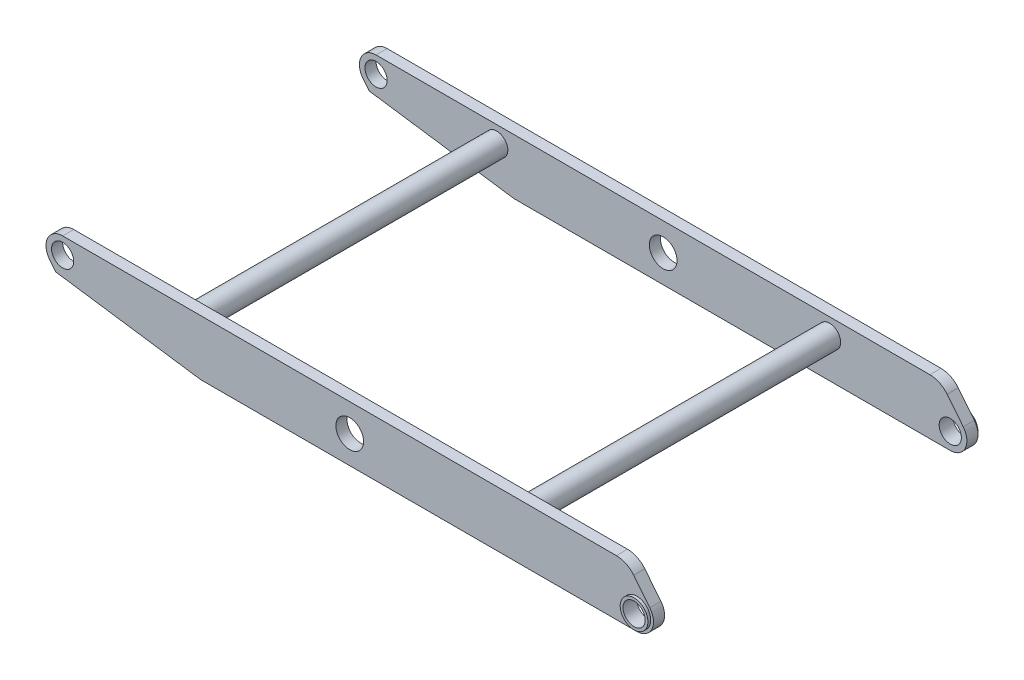
ISO-10303-21;
HEADER;
FILE_DESCRIPTION(('STEP AP214'),'2;1');
FILE_NAME('part.step','',(''),(''),'','','');
FILE_SCHEMA(('AUTOMOTIVE_DESIGN { 1 0 10303 214 1 1 1 1 }'));
ENDSEC;
DATA;
#1=APPLICATION_CONTEXT('core data for automotive mechanical design processes');
#2=APPLICATION_PROTOCOL_DEFINITION('international standard','automotive_design',2000,#1);
#3=PRODUCT_CONTEXT('',#1,'mechanical');
#4=PRODUCT('Part','Part','',(#3));
#5=PRODUCT_RELATED_PRODUCT_CATEGORY('part','',(#4));
#6=PRODUCT_DEFINITION_FORMATION('','',#4);
#7=PRODUCT_DEFINITION_CONTEXT('part definition',#1,'design');
#8=PRODUCT_DEFINITION('design','',#6,#7);
#9=PRODUCT_DEFINITION_SHAPE('','',#8);
#10=(LENGTH_UNIT() NAMED_UNIT(*) SI_UNIT(.MILLI.,.METRE.));
#11=(NAMED_UNIT(*) PLANE_ANGLE_UNIT() SI_UNIT($,.RADIAN.));
#12=(NAMED_UNIT(*) SI_UNIT($,.STERADIAN.) SOLID_ANGLE_UNIT());
#13=UNCERTAINTY_MEASURE_WITH_UNIT(LENGTH_MEASURE(1.E-05),#10,'distance_accuracy_value','');
#14=(GEOMETRIC_REPRESENTATION_CONTEXT(3) GLOBAL_UNCERTAINTY_ASSIGNED_CONTEXT((#13)) GLOBAL_UNIT_ASSIGNED_CONTEXT((#10,
#11,#12)) REPRESENTATION_CONTEXT('',''));
#15=CARTESIAN_POINT('',(0.,0.,0.));
#16=DIRECTION('',(0.,0.,1.));
#17=DIRECTION('',(1.,0.,0.));
#18=AXIS2_PLACEMENT_3D('',#15,#16,#17);
#19=CARTESIAN_POINT('',(48.0775006100537,1.,2.));
#20=DIRECTION('',(0.,0.,-1.));
#21=DIRECTION('',(-1.,0.,0.));
#22=AXIS2_PLACEMENT_3D('',#19,#20,#21);
#23=CYLINDRICAL_SURFACE('',#22,4.);
#24=CARTESIAN_POINT('',(48.0775006100537,1.,0.));
#25=DIRECTION('',(0.,0.,1.));
#26=DIRECTION('',(1.,0.,0.));
#27=AXIS2_PLACEMENT_3D('',#24,#25,#26);
#28=CIRCLE('',#27,4.);
#29=CARTESIAN_POINT('',(51.2009758478259,3.4987801902177,0.));
#30=VERTEX_POINT('',#29);
#31=CARTESIAN_POINT('',(48.0775006100537,5.00000000000001,0.));
#32=VERTEX_POINT('',#31);
#33=EDGE_CURVE('E136',#30,#32,#28,.T.);
#34=ORIENTED_EDGE('',*,*,#33,.T.);
#35=DIRECTION('',(0.,0.,-1.));
#36=VECTOR('',#35,1.);
#37=CARTESIAN_POINT('',(48.0775006100537,5.00000000000001,2.));
#38=LINE('',#37,#36);
#39=CARTESIAN_POINT('',(48.0775006100537,5.00000000000001,2.));
#40=VERTEX_POINT('',#39);
#41=EDGE_CURVE('E168',#40,#32,#38,.T.);
#42=ORIENTED_EDGE('',*,*,#41,.F.);
#43=CARTESIAN_POINT('',(48.0775006100537,1.,2.));
#44=DIRECTION('',(0.,0.,1.));
#45=DIRECTION('',(1.,0.,0.));
#46=AXIS2_PLACEMENT_3D('',#43,#44,#45);
#47=CIRCLE('',#46,4.);
#48=CARTESIAN_POINT('',(51.2009758478259,3.4987801902177,2.));
#49=VERTEX_POINT('',#48);
#50=EDGE_CURVE('E156',#49,#40,#47,.T.);
#51=ORIENTED_EDGE('',*,*,#50,.F.);
#52=DIRECTION('',(0.,0.,-1.));
#53=VECTOR('',#52,1.);
#54=CARTESIAN_POINT('',(51.2009758478259,3.4987801902177,2.));
#55=LINE('',#54,#53);
#56=EDGE_CURVE('E135',#49,#30,#55,.T.);
#57=ORIENTED_EDGE('',*,*,#56,.T.);
#58=EDGE_LOOP('',(#34,#42,#51,#57));
#59=FACE_BOUND('',#58,.T.);
#60=ADVANCED_FACE('F32',(#59),#23,.T.);
#61=CARTESIAN_POINT('',(0.,5.,2.));
#62=DIRECTION('',(0.,-1.,0.));
#63=DIRECTION('',(1.,0.,0.));
#64=AXIS2_PLACEMENT_3D('',#61,#62,#63);
#65=PLANE('',#64);
#66=DIRECTION('',(-1.,0.,0.));
#67=VECTOR('',#66,1.);
#68=CARTESIAN_POINT('',(0.,5.,0.));
#69=LINE('',#68,#67);
#70=CARTESIAN_POINT('',(-51.7581254575403,4.99999999999999,0.));
#71=VERTEX_POINT('',#70);
#72=EDGE_CURVE('E139',#32,#71,#69,.T.);
#73=ORIENTED_EDGE('',*,*,#72,.T.);
#74=DIRECTION('',(0.,0.,-1.));
#75=VECTOR('',#74,1.);
#76=CARTESIAN_POINT('',(-51.7581254575403,4.99999999999999,2.));
#77=LINE('',#76,#75);
#78=CARTESIAN_POINT('',(-51.7581254575403,4.99999999999999,2.));
#79=VERTEX_POINT('',#78);
#80=EDGE_CURVE('E165',#79,#71,#77,.T.);
#81=ORIENTED_EDGE('',*,*,#80,.F.);
#82=DIRECTION('',(-1.,0.,0.));
#83=VECTOR('',#82,1.);
#84=CARTESIAN_POINT('',(0.,5.,2.));
#85=LINE('',#84,#83);
#86=EDGE_CURVE('E93',#40,#79,#85,.T.);
#87=ORIENTED_EDGE('',*,*,#86,.F.);
#88=ORIENTED_EDGE('',*,*,#41,.T.);
#89=EDGE_LOOP('',(#73,#81,#87,#88));
#90=FACE_BOUND('',#89,.T.);
#91=ADVANCED_FACE('F206',(#90),#65,.F.);
#92=CARTESIAN_POINT('',(-51.7581254575403,1.99999999999999,2.));
#93=DIRECTION('',(0.,0.,-1.));
#94=DIRECTION('',(-1.,0.,0.));
#95=AXIS2_PLACEMENT_3D('',#92,#93,#94);
#96=CYLINDRICAL_SURFACE('',#95,3.);
#97=CARTESIAN_POINT('',(-51.7581254575403,1.99999999999999,0.));
#98=DIRECTION('',(0.,0.,1.));
#99=DIRECTION('',(1.,0.,0.));
#100=AXIS2_PLACEMENT_3D('',#97,#98,#99);
#101=CIRCLE('',#100,3.);
#102=CARTESIAN_POINT('',(-54.1007318858694,0.125914857336724,0.));
#103=VERTEX_POINT('',#102);
#104=EDGE_CURVE('E142',#71,#103,#101,.T.);
#105=ORIENTED_EDGE('',*,*,#104,.T.);
#106=DIRECTION('',(0.,0.,-1.));
#107=VECTOR('',#106,1.);
#108=CARTESIAN_POINT('',(-54.1007318858694,0.125914857336724,2.));
#109=LINE('',#108,#107);
#110=CARTESIAN_POINT('',(-54.1007318858694,0.125914857336724,2.));
#111=VERTEX_POINT('',#110);
#112=EDGE_CURVE('E162',#111,#103,#109,.T.);
#113=ORIENTED_EDGE('',*,*,#112,.F.);
#114=CARTESIAN_POINT('',(-51.7581254575403,1.99999999999999,2.));
#115=DIRECTION('',(0.,0.,1.));
#116=DIRECTION('',(1.,0.,0.));
#117=AXIS2_PLACEMENT_3D('',#114,#115,#116);
#118=CIRCLE('',#117,3.);
#119=EDGE_CURVE('E226',#79,#111,#118,.T.);
#120=ORIENTED_EDGE('',*,*,#119,.F.);
#121=ORIENTED_EDGE('',*,*,#80,.T.);
#122=EDGE_LOOP('',(#105,#113,#120,#121));
#123=FACE_BOUND('',#122,.T.);
#124=ADVANCED_FACE('F211',(#123),#96,.T.);
#125=CARTESIAN_POINT('',(-32.9268292682927,-26.3414634146342,2.));
#126=DIRECTION('',(0.780868809443031,0.624695047554424,0.));
#127=DIRECTION('',(-0.624695047554424,0.780868809443031,0.));
#128=AXIS2_PLACEMENT_3D('',#125,#126,#127);
#129=PLANE('',#128);
#130=DIRECTION('',(0.624695047554424,-0.780868809443031,0.));
#131=VECTOR('',#130,1.);
#132=CARTESIAN_POINT('',(-32.9268292682927,-26.3414634146342,0.));
#133=LINE('',#132,#131);
#134=CARTESIAN_POINT('',(-53.0025750009278,-1.24678124884027,0.));
#135=VERTEX_POINT('',#134);
#136=EDGE_CURVE('E144',#103,#135,#133,.T.);
#137=ORIENTED_EDGE('',*,*,#136,.T.);
#138=DIRECTION('',(0.,0.,-1.));
#139=VECTOR('',#138,1.);
#140=CARTESIAN_POINT('',(-53.0025750009278,-1.24678124884027,2.));
#141=LINE('',#140,#139);
#142=CARTESIAN_POINT('',(-53.0025750009278,-1.24678124884027,2.));
#143=VERTEX_POINT('',#142);
#144=EDGE_CURVE('E160',#143,#135,#141,.T.);
#145=ORIENTED_EDGE('',*,*,#144,.F.);
#146=DIRECTION('',(0.624695047554424,-0.780868809443031,0.));
#147=VECTOR('',#146,1.);
#148=CARTESIAN_POINT('',(-32.9268292682927,-26.3414634146342,2.));
#149=LINE('',#148,#147);
#150=EDGE_CURVE('E227',#111,#143,#149,.T.);
#151=ORIENTED_EDGE('',*,*,#150,.F.);
#152=ORIENTED_EDGE('',*,*,#112,.T.);
#153=EDGE_LOOP('',(#137,#145,#151,#152));
#154=FACE_BOUND('',#153,.T.);
#155=ADVANCED_FACE('F221',(#154),#129,.F.);
#156=CARTESIAN_POINT('',(-1.24846132995408,-8.68574917852038,2.));
#157=DIRECTION('',(-0.142274546472411,-0.989827234130315,0.));
#158=DIRECTION('',(0.989827234130315,-0.142274546472411,0.));
#159=AXIS2_PLACEMENT_3D('',#156,#157,#158);
#160=PLANE('',#159);
#161=DIRECTION('',(-0.989827234130315,0.142274546472411,0.));
#162=VECTOR('',#161,1.);
#163=CARTESIAN_POINT('',(-1.24846132995408,-8.68574917852038,0.));
#164=LINE('',#163,#162);
#165=CARTESIAN_POINT('',(-26.8908197526559,-5.00000000000001,0.));
#166=VERTEX_POINT('',#165);
#167=EDGE_CURVE('E147',#166,#135,#164,.T.);
#168=ORIENTED_EDGE('',*,*,#167,.F.);
#169=DIRECTION('',(0.,0.,-1.));
#170=VECTOR('',#169,1.);
#171=CARTESIAN_POINT('',(-26.8908197526559,-5.00000000000001,2.));
#172=LINE('',#171,#170);
#173=CARTESIAN_POINT('',(-26.8908197526559,-5.00000000000001,2.));
#174=VERTEX_POINT('',#173);
#175=EDGE_CURVE('E124',#174,#166,#172,.T.);
#176=ORIENTED_EDGE('',*,*,#175,.F.);
#177=DIRECTION('',(-0.989827234130315,0.142274546472411,0.));
#178=VECTOR('',#177,1.);
#179=CARTESIAN_POINT('',(-1.24846132995408,-8.68574917852038,2.));
#180=LINE('',#179,#178);
#181=EDGE_CURVE('E117',#174,#143,#180,.T.);
#182=ORIENTED_EDGE('',*,*,#181,.T.);
#183=ORIENTED_EDGE('',*,*,#144,.T.);
#184=EDGE_LOOP('',(#168,#176,#182,#183));
#185=FACE_BOUND('',#184,.T.);
#186=ADVANCED_FACE('F217',(#185),#160,.T.);
#187=CARTESIAN_POINT('',(0.,-5.00000000000001,2.));
#188=DIRECTION('',(0.,1.,0.));
#189=DIRECTION('',(-1.,0.,0.));
#190=AXIS2_PLACEMENT_3D('',#187,#188,#189);
#191=PLANE('',#190);
#192=DIRECTION('',(1.,0.,0.));
#193=VECTOR('',#192,1.);
#194=CARTESIAN_POINT('',(0.,-5.00000000000001,0.));
#195=LINE('',#194,#193);
#196=CARTESIAN_POINT('',(51.7581254575403,-5.00000000000001,0.));
#197=VERTEX_POINT('',#196);
#198=EDGE_CURVE('E123',#166,#197,#195,.T.);
#199=ORIENTED_EDGE('',*,*,#198,.T.);
#200=DIRECTION('',(0.,0.,-1.));
#201=VECTOR('',#200,1.);
#202=CARTESIAN_POINT('',(51.7581254575403,-5.00000000000001,2.));
#203=LINE('',#202,#201);
#204=CARTESIAN_POINT('',(51.7581254575403,-5.00000000000001,2.));
#205=VERTEX_POINT('',#204);
#206=EDGE_CURVE('E120',#205,#197,#203,.T.);
#207=ORIENTED_EDGE('',*,*,#206,.F.);
#208=DIRECTION('',(1.,0.,0.));
#209=VECTOR('',#208,1.);
#210=CARTESIAN_POINT('',(0.,-5.00000000000001,2.));
#211=LINE('',#210,#209);
#212=EDGE_CURVE('E110',#174,#205,#211,.T.);
#213=ORIENTED_EDGE('',*,*,#212,.F.);
#214=ORIENTED_EDGE('',*,*,#175,.T.);
#215=EDGE_LOOP('',(#199,#207,#213,#214));
#216=FACE_BOUND('',#215,.T.);
#217=ADVANCED_FACE('F121',(#216),#191,.F.);
#218=CARTESIAN_POINT('',(51.7581254575403,-2.00000000000001,2.));
#219=DIRECTION('',(0.,0.,-1.));
#220=DIRECTION('',(-1.,0.,0.));
#221=AXIS2_PLACEMENT_3D('',#218,#219,#220);
#222=CYLINDRICAL_SURFACE('',#221,3.00000000000001);
#223=CARTESIAN_POINT('',(51.7581254575403,-2.00000000000001,0.));
#224=DIRECTION('',(0.,0.,1.));
#225=DIRECTION('',(1.,0.,0.));
#226=AXIS2_PLACEMENT_3D('',#223,#224,#225);
#227=CIRCLE('',#226,3.00000000000001);
#228=CARTESIAN_POINT('',(54.1007318858694,-0.125914857336731,0.));
#229=VERTEX_POINT('',#228);
#230=EDGE_CURVE('E78',#197,#229,#227,.T.);
#231=ORIENTED_EDGE('',*,*,#230,.T.);
#232=DIRECTION('',(0.,0.,-1.));
#233=VECTOR('',#232,1.);
#234=CARTESIAN_POINT('',(54.1007318858694,-0.125914857336731,2.));
#235=LINE('',#234,#233);
#236=CARTESIAN_POINT('',(54.1007318858694,-0.125914857336731,2.));
#237=VERTEX_POINT('',#236);
#238=EDGE_CURVE('E125',#237,#229,#235,.T.);
#239=ORIENTED_EDGE('',*,*,#238,.F.);
#240=CARTESIAN_POINT('',(51.7581254575403,-2.00000000000001,2.));
#241=DIRECTION('',(0.,0.,1.));
#242=DIRECTION('',(1.,0.,0.));
#243=AXIS2_PLACEMENT_3D('',#240,#241,#242);
#244=CIRCLE('',#243,3.00000000000001);
#245=EDGE_CURVE('E115',#205,#237,#244,.T.);
#246=ORIENTED_EDGE('',*,*,#245,.F.);
#247=ORIENTED_EDGE('',*,*,#206,.T.);
#248=EDGE_LOOP('',(#231,#239,#246,#247));
#249=FACE_BOUND('',#248,.T.);
#250=ADVANCED_FACE('F127',(#249),#222,.T.);
#251=CARTESIAN_POINT('',(32.9268292682927,26.3414634146341,2.));
#252=DIRECTION('',(-0.780868809443031,-0.624695047554424,0.));
#253=DIRECTION('',(0.624695047554424,-0.780868809443031,0.));
#254=AXIS2_PLACEMENT_3D('',#251,#252,#253);
#255=PLANE('',#254);
#256=DIRECTION('',(-0.624695047554424,0.780868809443031,0.));
#257=VECTOR('',#256,1.);
#258=CARTESIAN_POINT('',(32.9268292682927,26.3414634146341,0.));
#259=LINE('',#258,#257);
#260=EDGE_CURVE('E84',#229,#30,#259,.T.);
#261=ORIENTED_EDGE('',*,*,#260,.T.);
#262=ORIENTED_EDGE('',*,*,#56,.F.);
#263=DIRECTION('',(-0.624695047554424,0.780868809443031,0.));
#264=VECTOR('',#263,1.);
#265=CARTESIAN_POINT('',(32.9268292682927,26.3414634146341,2.));
#266=LINE('',#265,#264);
#267=EDGE_CURVE('E48',#237,#49,#266,.T.);
#268=ORIENTED_EDGE('',*,*,#267,.F.);
#269=ORIENTED_EDGE('',*,*,#238,.T.);
#270=EDGE_LOOP('',(#261,#262,#268,#269));
#271=FACE_BOUND('',#270,.T.);
#272=ADVANCED_FACE('F195',(#271),#255,.F.);
#273=CARTESIAN_POINT('',(0.,0.,2.));
#274=DIRECTION('',(0.,0.,-1.));
#275=DIRECTION('',(-1.,0.,0.));
#276=AXIS2_PLACEMENT_3D('',#273,#274,#275);
#277=CYLINDRICAL_SURFACE('',#276,2.5);
#278=CARTESIAN_POINT('',(0.,0.,2.));
#279=DIRECTION('',(0.,0.,1.));
#280=DIRECTION('',(1.,0.,0.));
#281=AXIS2_PLACEMENT_3D('',#278,#279,#280);
#282=CIRCLE('',#281,2.5);
#283=CARTESIAN_POINT('',(2.5,0.,2.));
#284=VERTEX_POINT('',#283);
#285=EDGE_CURVE('E129',#284,#284,#282,.T.);
#286=ORIENTED_EDGE('',*,*,#285,.T.);
#287=EDGE_LOOP('',(#286));
#288=FACE_BOUND('',#287,.T.);
#289=CARTESIAN_POINT('',(0.,0.,0.));
#290=DIRECTION('',(0.,0.,1.));
#291=DIRECTION('',(1.,0.,0.));
#292=AXIS2_PLACEMENT_3D('',#289,#290,#291);
#293=CIRCLE('',#292,2.5);
#294=CARTESIAN_POINT('',(2.5,0.,0.));
#295=VERTEX_POINT('',#294);
#296=EDGE_CURVE('E153',#295,#295,#293,.T.);
#297=ORIENTED_EDGE('',*,*,#296,.F.);
#298=EDGE_LOOP('',(#297));
#299=FACE_BOUND('',#298,.T.);
#300=ADVANCED_FACE('F193',(#288,#299),#277,.F.);
#301=CARTESIAN_POINT('',(0.,0.,2.));
#302=DIRECTION('',(0.,0.,1.));
#303=DIRECTION('',(1.,0.,0.));
#304=AXIS2_PLACEMENT_3D('',#301,#302,#303);
#305=PLANE('',#304);
#306=CARTESIAN_POINT('',(-51.7581254575403,1.99999999999999,2.));
#307=DIRECTION('',(0.,0.,1.));
#308=DIRECTION('',(1.,0.,0.));
#309=AXIS2_PLACEMENT_3D('',#306,#307,#308);
#310=CIRCLE('',#309,2.);
#311=CARTESIAN_POINT('',(-49.7581254575403,1.99999999999999,2.));
#312=VERTEX_POINT('',#311);
#313=EDGE_CURVE('E236',#312,#312,#310,.T.);
#314=ORIENTED_EDGE('',*,*,#313,.F.);
#315=EDGE_LOOP('',(#314));
#316=FACE_BOUND('',#315,.T.);
#317=CARTESIAN_POINT('',(51.7581254575403,-2.00000000000001,2.));
#318=DIRECTION('',(0.,0.,1.));
#319=DIRECTION('',(1.,0.,0.));
#320=AXIS2_PLACEMENT_3D('',#317,#318,#319);
#321=CIRCLE('',#320,2.5);
#322=CARTESIAN_POINT('',(54.2581254575403,-2.00000000000001,2.));
#323=VERTEX_POINT('',#322);
#324=EDGE_CURVE('E233',#323,#323,#321,.T.);
#325=ORIENTED_EDGE('',*,*,#324,.F.);
#326=EDGE_LOOP('',(#325));
#327=FACE_BOUND('',#326,.T.);
#328=ORIENTED_EDGE('',*,*,#50,.T.);
#329=ORIENTED_EDGE('',*,*,#86,.T.);
#330=ORIENTED_EDGE('',*,*,#119,.T.);
#331=ORIENTED_EDGE('',*,*,#150,.T.);
#332=ORIENTED_EDGE('',*,*,#181,.F.);
#333=ORIENTED_EDGE('',*,*,#212,.T.);
#334=ORIENTED_EDGE('',*,*,#245,.T.);
#335=ORIENTED_EDGE('',*,*,#267,.T.);
#336=EDGE_LOOP('',(#328,#329,#330,#331,#332,#333,#334,#335));
#337=FACE_BOUND('',#336,.T.);
#338=ORIENTED_EDGE('',*,*,#285,.F.);
#339=EDGE_LOOP('',(#338));
#340=FACE_BOUND('',#339,.T.);
#341=ADVANCED_FACE('F112',(#316,#327,#337,#340),#305,.T.);
#342=CARTESIAN_POINT('',(0.,0.,0.));
#343=DIRECTION('',(0.,0.,1.));
#344=DIRECTION('',(1.,0.,0.));
#345=AXIS2_PLACEMENT_3D('',#342,#343,#344);
#346=PLANE('',#345);
#347=CARTESIAN_POINT('',(30.,2.,0.));
#348=DIRECTION('',(0.,0.,1.));
#349=DIRECTION('',(1.,0.,0.));
#350=AXIS2_PLACEMENT_3D('',#347,#348,#349);
#351=CIRCLE('',#350,2.);
#352=CARTESIAN_POINT('',(32.,2.,0.));
#353=VERTEX_POINT('',#352);
#354=EDGE_CURVE('E11',#353,#353,#351,.F.);
#355=ORIENTED_EDGE('',*,*,#354,.F.);
#356=EDGE_LOOP('',(#355));
#357=FACE_BOUND('',#356,.T.);
#358=CARTESIAN_POINT('',(-30.,2.,0.));
#359=DIRECTION('',(0.,0.,1.));
#360=DIRECTION('',(1.,0.,0.));
#361=AXIS2_PLACEMENT_3D('',#358,#359,#360);
#362=CIRCLE('',#361,2.);
#363=CARTESIAN_POINT('',(-28.,2.,0.));
#364=VERTEX_POINT('',#363);
#365=EDGE_CURVE('E40',#364,#364,#362,.F.);
#366=ORIENTED_EDGE('',*,*,#365,.F.);
#367=EDGE_LOOP('',(#366));
#368=FACE_BOUND('',#367,.T.);
#369=CARTESIAN_POINT('',(-51.7581254575403,1.99999999999999,0.));
#370=DIRECTION('',(0.,0.,1.));
#371=DIRECTION('',(1.,0.,0.));
#372=AXIS2_PLACEMENT_3D('',#369,#370,#371);
#373=CIRCLE('',#372,2.);
#374=CARTESIAN_POINT('',(-49.7581254575403,1.99999999999999,0.));
#375=VERTEX_POINT('',#374);
#376=EDGE_CURVE('E184',#375,#375,#373,.T.);
#377=ORIENTED_EDGE('',*,*,#376,.T.);
#378=EDGE_LOOP('',(#377));
#379=FACE_BOUND('',#378,.T.);
#380=CARTESIAN_POINT('',(51.7581254575403,-2.00000000000001,0.));
#381=DIRECTION('',(0.,0.,1.));
#382=DIRECTION('',(1.,0.,0.));
#383=AXIS2_PLACEMENT_3D('',#380,#381,#382);
#384=CIRCLE('',#383,2.);
#385=CARTESIAN_POINT('',(53.7581254575403,-2.00000000000001,0.));
#386=VERTEX_POINT('',#385);
#387=EDGE_CURVE('E188',#386,#386,#384,.T.);
#388=ORIENTED_EDGE('',*,*,#387,.T.);
#389=EDGE_LOOP('',(#388));
#390=FACE_BOUND('',#389,.T.);
#391=ORIENTED_EDGE('',*,*,#33,.F.);
#392=ORIENTED_EDGE('',*,*,#260,.F.);
#393=ORIENTED_EDGE('',*,*,#230,.F.);
#394=ORIENTED_EDGE('',*,*,#198,.F.);
#395=ORIENTED_EDGE('',*,*,#167,.T.);
#396=ORIENTED_EDGE('',*,*,#136,.F.);
#397=ORIENTED_EDGE('',*,*,#104,.F.);
#398=ORIENTED_EDGE('',*,*,#72,.F.);
#399=EDGE_LOOP('',(#391,#392,#393,#394,#395,#396,#397,#398));
#400=FACE_BOUND('',#399,.T.);
#401=ORIENTED_EDGE('',*,*,#296,.T.);
#402=EDGE_LOOP('',(#401));
#403=FACE_BOUND('',#402,.T.);
#404=ADVANCED_FACE('F175',(#357,#368,#379,#390,#400,#403),#346,.F.);
#405=CARTESIAN_POINT('',(51.7581254575403,-2.00000000000001,2.5));
#406=DIRECTION('',(0.,0.,-1.));
#407=DIRECTION('',(-1.,0.,0.));
#408=AXIS2_PLACEMENT_3D('',#405,#406,#407);
#409=CYLINDRICAL_SURFACE('',#408,2.5);
#410=CARTESIAN_POINT('',(51.7581254575403,-2.00000000000001,2.5));
#411=DIRECTION('',(0.,0.,1.));
#412=DIRECTION('',(1.,0.,0.));
#413=AXIS2_PLACEMENT_3D('',#410,#411,#412);
#414=CIRCLE('',#413,2.5);
#415=CARTESIAN_POINT('',(54.2581254575403,-2.00000000000001,2.5));
#416=VERTEX_POINT('',#415);
#417=EDGE_CURVE('E140',#416,#416,#414,.T.);
#418=ORIENTED_EDGE('',*,*,#417,.F.);
#419=EDGE_LOOP('',(#418));
#420=FACE_BOUND('',#419,.T.);
#421=ORIENTED_EDGE('',*,*,#324,.T.);
#422=EDGE_LOOP('',(#421));
#423=FACE_BOUND('',#422,.T.);
#424=ADVANCED_FACE('F178',(#420,#423),#409,.T.);
#425=CARTESIAN_POINT('',(51.7581254575403,-2.00000000000001,2.5));
#426=DIRECTION('',(0.,0.,1.));
#427=DIRECTION('',(1.,0.,0.));
#428=AXIS2_PLACEMENT_3D('',#425,#426,#427);
#429=PLANE('',#428);
#430=CARTESIAN_POINT('',(51.7581254575403,-2.00000000000001,2.5));
#431=DIRECTION('',(0.,0.,1.));
#432=DIRECTION('',(1.,0.,0.));
#433=AXIS2_PLACEMENT_3D('',#430,#431,#432);
#434=CIRCLE('',#433,2.);
#435=CARTESIAN_POINT('',(53.7581254575403,-2.00000000000001,2.5));
#436=VERTEX_POINT('',#435);
#437=EDGE_CURVE('E242',#436,#436,#434,.T.);
#438=ORIENTED_EDGE('',*,*,#437,.F.);
#439=EDGE_LOOP('',(#438));
#440=FACE_BOUND('',#439,.T.);
#441=ORIENTED_EDGE('',*,*,#417,.T.);
#442=EDGE_LOOP('',(#441));
#443=FACE_BOUND('',#442,.T.);
#444=ADVANCED_FACE('F421',(#440,#443),#429,.T.);
#445=CARTESIAN_POINT('',(51.7581254575403,-2.00000000000001,0.));
#446=DIRECTION('',(0.,0.,1.));
#447=DIRECTION('',(1.,0.,0.));
#448=AXIS2_PLACEMENT_3D('',#445,#446,#447);
#449=CYLINDRICAL_SURFACE('',#448,2.);
#450=ORIENTED_EDGE('',*,*,#387,.F.);
#451=EDGE_LOOP('',(#450));
#452=FACE_BOUND('',#451,.T.);
#453=ORIENTED_EDGE('',*,*,#437,.T.);
#454=EDGE_LOOP('',(#453));
#455=FACE_BOUND('',#454,.T.);
#456=ADVANCED_FACE('F417',(#452,#455),#449,.F.);
#457=CARTESIAN_POINT('',(-51.7581254575403,1.99999999999999,0.));
#458=DIRECTION('',(0.,0.,1.));
#459=DIRECTION('',(1.,0.,0.));
#460=AXIS2_PLACEMENT_3D('',#457,#458,#459);
#461=CYLINDRICAL_SURFACE('',#460,2.);
#462=ORIENTED_EDGE('',*,*,#313,.T.);
#463=EDGE_LOOP('',(#462));
#464=FACE_BOUND('',#463,.T.);
#465=ORIENTED_EDGE('',*,*,#376,.F.);
#466=EDGE_LOOP('',(#465));
#467=FACE_BOUND('',#466,.T.);
#468=ADVANCED_FACE('F414',(#464,#467),#461,.F.);
#469=CARTESIAN_POINT('',(-30.,2.,-27.25));
#470=DIRECTION('',(0.,0.,1.));
#471=DIRECTION('',(1.,0.,0.));
#472=AXIS2_PLACEMENT_3D('',#469,#470,#471);
#473=CYLINDRICAL_SURFACE('',#472,2.);
#474=ORIENTED_EDGE('',*,*,#365,.T.);
#475=EDGE_LOOP('',(#474));
#476=FACE_BOUND('',#475,.T.);
#477=CARTESIAN_POINT('',(-30.,2.,-54.5));
#478=DIRECTION('',(0.,0.,1.));
#479=DIRECTION('',(1.,0.,0.));
#480=AXIS2_PLACEMENT_3D('',#477,#478,#479);
#481=CIRCLE('',#480,2.);
#482=CARTESIAN_POINT('',(-28.,2.,-54.5));
#483=VERTEX_POINT('',#482);
#484=EDGE_CURVE('E249',#483,#483,#481,.F.);
#485=ORIENTED_EDGE('',*,*,#484,.F.);
#486=EDGE_LOOP('',(#485));
#487=FACE_BOUND('',#486,.T.);
#488=ADVANCED_FACE('F172',(#476,#487),#473,.T.);
#489=CARTESIAN_POINT('',(30.,2.,-27.25));
#490=DIRECTION('',(0.,0.,1.));
#491=DIRECTION('',(1.,0.,0.));
#492=AXIS2_PLACEMENT_3D('',#489,#490,#491);
#493=CYLINDRICAL_SURFACE('',#492,2.);
#494=ORIENTED_EDGE('',*,*,#354,.T.);
#495=EDGE_LOOP('',(#494));
#496=FACE_BOUND('',#495,.T.);
#497=CARTESIAN_POINT('',(30.,2.,-54.5));
#498=DIRECTION('',(0.,0.,1.));
#499=DIRECTION('',(1.,0.,0.));
#500=AXIS2_PLACEMENT_3D('',#497,#498,#499);
#501=CIRCLE('',#500,2.);
#502=CARTESIAN_POINT('',(32.,2.,-54.5));
#503=VERTEX_POINT('',#502);
#504=EDGE_CURVE('E245',#503,#503,#501,.F.);
#505=ORIENTED_EDGE('',*,*,#504,.F.);
#506=EDGE_LOOP('',(#505));
#507=FACE_BOUND('',#506,.T.);
#508=ADVANCED_FACE('F407',(#496,#507),#493,.T.);
#509=CARTESIAN_POINT('',(48.0775006100537,1.,-56.5));
#510=DIRECTION('',(0.,0.,1.));
#511=DIRECTION('',(-1.,0.,0.));
#512=AXIS2_PLACEMENT_3D('',#509,#510,#511);
#513=CYLINDRICAL_SURFACE('',#512,4.);
#514=CARTESIAN_POINT('',(48.0775006100537,1.,-54.5));
#515=DIRECTION('',(0.,0.,1.));
#516=DIRECTION('',(1.,0.,0.));
#517=AXIS2_PLACEMENT_3D('',#514,#515,#516);
#518=CIRCLE('',#517,4.);
#519=CARTESIAN_POINT('',(51.2009758478259,3.4987801902177,-54.5));
#520=VERTEX_POINT('',#519);
#521=CARTESIAN_POINT('',(48.0775006100537,5.00000000000001,-54.5));
#522=VERTEX_POINT('',#521);
#523=EDGE_CURVE('E302',#520,#522,#518,.T.);
#524=ORIENTED_EDGE('',*,*,#523,.F.);
#525=DIRECTION('',(0.,0.,1.));
#526=VECTOR('',#525,1.);
#527=CARTESIAN_POINT('',(51.2009758478259,3.4987801902177,-56.5));
#528=LINE('',#527,#526);
#529=CARTESIAN_POINT('',(51.2009758478259,3.4987801902177,-56.5));
#530=VERTEX_POINT('',#529);
#531=EDGE_CURVE('E273',#530,#520,#528,.T.);
#532=ORIENTED_EDGE('',*,*,#531,.F.);
#533=CARTESIAN_POINT('',(48.0775006100537,1.,-56.5));
#534=DIRECTION('',(0.,0.,1.));
#535=DIRECTION('',(1.,0.,0.));
#536=AXIS2_PLACEMENT_3D('',#533,#534,#535);
#537=CIRCLE('',#536,4.);
#538=CARTESIAN_POINT('',(48.0775006100537,5.00000000000001,-56.5));
#539=VERTEX_POINT('',#538);
#540=EDGE_CURVE('E280',#530,#539,#537,.T.);
#541=ORIENTED_EDGE('',*,*,#540,.T.);
#542=DIRECTION('',(0.,0.,1.));
#543=VECTOR('',#542,1.);
#544=CARTESIAN_POINT('',(48.0775006100537,5.00000000000001,-56.5));
#545=LINE('',#544,#543);
#546=EDGE_CURVE('E252',#539,#522,#545,.T.);
#547=ORIENTED_EDGE('',*,*,#546,.T.);
#548=EDGE_LOOP('',(#524,#532,#541,#547));
#549=FACE_BOUND('',#548,.T.);
#550=ADVANCED_FACE('F403',(#549),#513,.T.);
#551=CARTESIAN_POINT('',(0.,5.,-56.5));
#552=DIRECTION('',(0.,-1.,0.));
#553=DIRECTION('',(1.,0.,0.));
#554=AXIS2_PLACEMENT_3D('',#551,#552,#553);
#555=PLANE('',#554);
#556=DIRECTION('',(-1.,0.,0.));
#557=VECTOR('',#556,1.);
#558=CARTESIAN_POINT('',(0.,5.,-54.5));
#559=LINE('',#558,#557);
#560=CARTESIAN_POINT('',(-51.7581254575403,4.99999999999999,-54.5));
#561=VERTEX_POINT('',#560);
#562=EDGE_CURVE('E299',#522,#561,#559,.T.);
#563=ORIENTED_EDGE('',*,*,#562,.F.);
#564=ORIENTED_EDGE('',*,*,#546,.F.);
#565=DIRECTION('',(-1.,0.,0.));
#566=VECTOR('',#565,1.);
#567=CARTESIAN_POINT('',(0.,5.,-56.5));
#568=LINE('',#567,#566);
#569=CARTESIAN_POINT('',(-51.7581254575403,4.99999999999999,-56.5));
#570=VERTEX_POINT('',#569);
#571=EDGE_CURVE('E326',#539,#570,#568,.T.);
#572=ORIENTED_EDGE('',*,*,#571,.T.);
#573=DIRECTION('',(0.,0.,1.));
#574=VECTOR('',#573,1.);
#575=CARTESIAN_POINT('',(-51.7581254575403,4.99999999999999,-56.5));
#576=LINE('',#575,#574);
#577=EDGE_CURVE('E255',#570,#561,#576,.T.);
#578=ORIENTED_EDGE('',*,*,#577,.T.);
#579=EDGE_LOOP('',(#563,#564,#572,#578));
#580=FACE_BOUND('',#579,.T.);
#581=ADVANCED_FACE('F399',(#580),#555,.F.);
#582=CARTESIAN_POINT('',(-51.7581254575403,1.99999999999999,-56.5));
#583=DIRECTION('',(0.,0.,1.));
#584=DIRECTION('',(-1.,0.,0.));
#585=AXIS2_PLACEMENT_3D('',#582,#583,#584);
#586=CYLINDRICAL_SURFACE('',#585,3.);
#587=CARTESIAN_POINT('',(-51.7581254575403,1.99999999999999,-54.5));
#588=DIRECTION('',(0.,0.,1.));
#589=DIRECTION('',(1.,0.,0.));
#590=AXIS2_PLACEMENT_3D('',#587,#588,#589);
#591=CIRCLE('',#590,3.);
#592=CARTESIAN_POINT('',(-54.1007318858694,0.125914857336724,-54.5));
#593=VERTEX_POINT('',#592);
#594=EDGE_CURVE('E296',#561,#593,#591,.T.);
#595=ORIENTED_EDGE('',*,*,#594,.F.);
#596=ORIENTED_EDGE('',*,*,#577,.F.);
#597=CARTESIAN_POINT('',(-51.7581254575403,1.99999999999999,-56.5));
#598=DIRECTION('',(0.,0.,1.));
#599=DIRECTION('',(1.,0.,0.));
#600=AXIS2_PLACEMENT_3D('',#597,#598,#599);
#601=CIRCLE('',#600,3.);
#602=CARTESIAN_POINT('',(-54.1007318858694,0.125914857336724,-56.5));
#603=VERTEX_POINT('',#602);
#604=EDGE_CURVE('E323',#570,#603,#601,.T.);
#605=ORIENTED_EDGE('',*,*,#604,.T.);
#606=DIRECTION('',(0.,0.,1.));
#607=VECTOR('',#606,1.);
#608=CARTESIAN_POINT('',(-54.1007318858694,0.125914857336724,-56.5));
#609=LINE('',#608,#607);
#610=EDGE_CURVE('E258',#603,#593,#609,.T.);
#611=ORIENTED_EDGE('',*,*,#610,.T.);
#612=EDGE_LOOP('',(#595,#596,#605,#611));
#613=FACE_BOUND('',#612,.T.);
#614=ADVANCED_FACE('F395',(#613),#586,.T.);
#615=CARTESIAN_POINT('',(-32.9268292682927,-26.3414634146342,-56.5));
#616=DIRECTION('',(0.780868809443031,0.624695047554424,0.));
#617=DIRECTION('',(-0.624695047554424,0.780868809443031,0.));
#618=AXIS2_PLACEMENT_3D('',#615,#616,#617);
#619=PLANE('',#618);
#620=DIRECTION('',(0.624695047554424,-0.780868809443031,0.));
#621=VECTOR('',#620,1.);
#622=CARTESIAN_POINT('',(-32.9268292682927,-26.3414634146342,-54.5));
#623=LINE('',#622,#621);
#624=CARTESIAN_POINT('',(-53.0025750009278,-1.24678124884027,-54.5));
#625=VERTEX_POINT('',#624);
#626=EDGE_CURVE('E293',#593,#625,#623,.T.);
#627=ORIENTED_EDGE('',*,*,#626,.F.);
#628=ORIENTED_EDGE('',*,*,#610,.F.);
#629=DIRECTION('',(0.624695047554424,-0.780868809443031,0.));
#630=VECTOR('',#629,1.);
#631=CARTESIAN_POINT('',(-32.9268292682927,-26.3414634146342,-56.5));
#632=LINE('',#631,#630);
#633=CARTESIAN_POINT('',(-53.0025750009278,-1.24678124884027,-56.5));
#634=VERTEX_POINT('',#633);
#635=EDGE_CURVE('E320',#603,#634,#632,.T.);
#636=ORIENTED_EDGE('',*,*,#635,.T.);
#637=DIRECTION('',(0.,0.,1.));
#638=VECTOR('',#637,1.);
#639=CARTESIAN_POINT('',(-53.0025750009278,-1.24678124884027,-56.5));
#640=LINE('',#639,#638);
#641=EDGE_CURVE('E261',#634,#625,#640,.T.);
#642=ORIENTED_EDGE('',*,*,#641,.T.);
#643=EDGE_LOOP('',(#627,#628,#636,#642));
#644=FACE_BOUND('',#643,.T.);
#645=ADVANCED_FACE('F391',(#644),#619,.F.);
#646=CARTESIAN_POINT('',(-1.24846132995408,-8.68574917852038,-56.5));
#647=DIRECTION('',(-0.142274546472411,-0.989827234130315,0.));
#648=DIRECTION('',(0.989827234130315,-0.142274546472411,0.));
#649=AXIS2_PLACEMENT_3D('',#646,#647,#648);
#650=PLANE('',#649);
#651=DIRECTION('',(-0.989827234130315,0.142274546472411,0.));
#652=VECTOR('',#651,1.);
#653=CARTESIAN_POINT('',(-1.24846132995408,-8.68574917852038,-54.5));
#654=LINE('',#653,#652);
#655=CARTESIAN_POINT('',(-26.8908197526559,-5.00000000000001,-54.5));
#656=VERTEX_POINT('',#655);
#657=EDGE_CURVE('E290',#656,#625,#654,.T.);
#658=ORIENTED_EDGE('',*,*,#657,.T.);
#659=ORIENTED_EDGE('',*,*,#641,.F.);
#660=DIRECTION('',(-0.989827234130315,0.142274546472411,0.));
#661=VECTOR('',#660,1.);
#662=CARTESIAN_POINT('',(-1.24846132995408,-8.68574917852038,-56.5));
#663=LINE('',#662,#661);
#664=CARTESIAN_POINT('',(-26.8908197526559,-5.00000000000001,-56.5));
#665=VERTEX_POINT('',#664);
#666=EDGE_CURVE('E317',#665,#634,#663,.T.);
#667=ORIENTED_EDGE('',*,*,#666,.F.);
#668=DIRECTION('',(0.,0.,1.));
#669=VECTOR('',#668,1.);
#670=CARTESIAN_POINT('',(-26.8908197526559,-5.00000000000001,-56.5));
#671=LINE('',#670,#669);
#672=EDGE_CURVE('E264',#665,#656,#671,.T.);
#673=ORIENTED_EDGE('',*,*,#672,.T.);
#674=EDGE_LOOP('',(#658,#659,#667,#673));
#675=FACE_BOUND('',#674,.T.);
#676=ADVANCED_FACE('F387',(#675),#650,.T.);
#677=CARTESIAN_POINT('',(0.,-5.00000000000001,-56.5));
#678=DIRECTION('',(0.,1.,0.));
#679=DIRECTION('',(-1.,0.,0.));
#680=AXIS2_PLACEMENT_3D('',#677,#678,#679);
#681=PLANE('',#680);
#682=DIRECTION('',(1.,0.,0.));
#683=VECTOR('',#682,1.);
#684=CARTESIAN_POINT('',(0.,-5.00000000000001,-54.5));
#685=LINE('',#684,#683);
#686=CARTESIAN_POINT('',(51.7581254575403,-5.00000000000001,-54.5));
#687=VERTEX_POINT('',#686);
#688=EDGE_CURVE('E287',#656,#687,#685,.T.);
#689=ORIENTED_EDGE('',*,*,#688,.F.);
#690=ORIENTED_EDGE('',*,*,#672,.F.);
#691=DIRECTION('',(1.,0.,0.));
#692=VECTOR('',#691,1.);
#693=CARTESIAN_POINT('',(0.,-5.00000000000001,-56.5));
#694=LINE('',#693,#692);
#695=CARTESIAN_POINT('',(51.7581254575403,-5.00000000000001,-56.5));
#696=VERTEX_POINT('',#695);
#697=EDGE_CURVE('E314',#665,#696,#694,.T.);
#698=ORIENTED_EDGE('',*,*,#697,.T.);
#699=DIRECTION('',(0.,0.,1.));
#700=VECTOR('',#699,1.);
#701=CARTESIAN_POINT('',(51.7581254575403,-5.00000000000001,-56.5));
#702=LINE('',#701,#700);
#703=EDGE_CURVE('E267',#696,#687,#702,.T.);
#704=ORIENTED_EDGE('',*,*,#703,.T.);
#705=EDGE_LOOP('',(#689,#690,#698,#704));
#706=FACE_BOUND('',#705,.T.);
#707=ADVANCED_FACE('F383',(#706),#681,.F.);
#708=CARTESIAN_POINT('',(51.7581254575403,-2.00000000000001,-56.5));
#709=DIRECTION('',(0.,0.,1.));
#710=DIRECTION('',(-1.,0.,0.));
#711=AXIS2_PLACEMENT_3D('',#708,#709,#710);
#712=CYLINDRICAL_SURFACE('',#711,3.00000000000001);
#713=CARTESIAN_POINT('',(51.7581254575403,-2.00000000000001,-54.5));
#714=DIRECTION('',(0.,0.,1.));
#715=DIRECTION('',(1.,0.,0.));
#716=AXIS2_PLACEMENT_3D('',#713,#714,#715);
#717=CIRCLE('',#716,3.00000000000001);
#718=CARTESIAN_POINT('',(54.1007318858694,-0.125914857336731,-54.5));
#719=VERTEX_POINT('',#718);
#720=EDGE_CURVE('E284',#687,#719,#717,.T.);
#721=ORIENTED_EDGE('',*,*,#720,.F.);
#722=ORIENTED_EDGE('',*,*,#703,.F.);
#723=CARTESIAN_POINT('',(51.7581254575403,-2.00000000000001,-56.5));
#724=DIRECTION('',(0.,0.,1.));
#725=DIRECTION('',(1.,0.,0.));
#726=AXIS2_PLACEMENT_3D('',#723,#724,#725);
#727=CIRCLE('',#726,3.00000000000001);
#728=CARTESIAN_POINT('',(54.1007318858694,-0.125914857336731,-56.5));
#729=VERTEX_POINT('',#728);
#730=EDGE_CURVE('E311',#696,#729,#727,.T.);
#731=ORIENTED_EDGE('',*,*,#730,.T.);
#732=DIRECTION('',(0.,0.,1.));
#733=VECTOR('',#732,1.);
#734=CARTESIAN_POINT('',(54.1007318858694,-0.125914857336731,-56.5));
#735=LINE('',#734,#733);
#736=EDGE_CURVE('E270',#729,#719,#735,.T.);
#737=ORIENTED_EDGE('',*,*,#736,.T.);
#738=EDGE_LOOP('',(#721,#722,#731,#737));
#739=FACE_BOUND('',#738,.T.);
#740=ADVANCED_FACE('F376',(#739),#712,.T.);
#741=CARTESIAN_POINT('',(32.9268292682927,26.3414634146341,-56.5));
#742=DIRECTION('',(-0.780868809443031,-0.624695047554424,0.));
#743=DIRECTION('',(0.624695047554424,-0.780868809443031,0.));
#744=AXIS2_PLACEMENT_3D('',#741,#742,#743);
#745=PLANE('',#744);
#746=DIRECTION('',(-0.624695047554424,0.780868809443031,0.));
#747=VECTOR('',#746,1.);
#748=CARTESIAN_POINT('',(32.9268292682927,26.3414634146341,-54.5));
#749=LINE('',#748,#747);
#750=EDGE_CURVE('E281',#719,#520,#749,.T.);
#751=ORIENTED_EDGE('',*,*,#750,.F.);
#752=ORIENTED_EDGE('',*,*,#736,.F.);
#753=DIRECTION('',(-0.624695047554424,0.780868809443031,0.));
#754=VECTOR('',#753,1.);
#755=CARTESIAN_POINT('',(32.9268292682927,26.3414634146341,-56.5));
#756=LINE('',#755,#754);
#757=EDGE_CURVE('E308',#729,#530,#756,.T.);
#758=ORIENTED_EDGE('',*,*,#757,.T.);
#759=ORIENTED_EDGE('',*,*,#531,.T.);
#760=EDGE_LOOP('',(#751,#752,#758,#759));
#761=FACE_BOUND('',#760,.T.);
#762=ADVANCED_FACE('F367',(#761),#745,.F.);
#763=CARTESIAN_POINT('',(0.,0.,-56.5));
#764=DIRECTION('',(0.,0.,1.));
#765=DIRECTION('',(-1.,0.,0.));
#766=AXIS2_PLACEMENT_3D('',#763,#764,#765);
#767=CYLINDRICAL_SURFACE('',#766,2.5);
#768=CARTESIAN_POINT('',(0.,0.,-56.5));
#769=DIRECTION('',(0.,0.,1.));
#770=DIRECTION('',(1.,0.,0.));
#771=AXIS2_PLACEMENT_3D('',#768,#769,#770);
#772=CIRCLE('',#771,2.5);
#773=CARTESIAN_POINT('',(2.5,0.,-56.5));
#774=VERTEX_POINT('',#773);
#775=EDGE_CURVE('E276',#774,#774,#772,.T.);
#776=ORIENTED_EDGE('',*,*,#775,.F.);
#777=EDGE_LOOP('',(#776));
#778=FACE_BOUND('',#777,.T.);
#779=CARTESIAN_POINT('',(0.,0.,-54.5));
#780=DIRECTION('',(0.,0.,1.));
#781=DIRECTION('',(1.,0.,0.));
#782=AXIS2_PLACEMENT_3D('',#779,#780,#781);
#783=CIRCLE('',#782,2.5);
#784=CARTESIAN_POINT('',(2.5,0.,-54.5));
#785=VERTEX_POINT('',#784);
#786=EDGE_CURVE('E277',#785,#785,#783,.T.);
#787=ORIENTED_EDGE('',*,*,#786,.T.);
#788=EDGE_LOOP('',(#787));
#789=FACE_BOUND('',#788,.T.);
#790=ADVANCED_FACE('F365',(#778,#789),#767,.F.);
#791=CARTESIAN_POINT('',(0.,0.,-56.5));
#792=DIRECTION('',(0.,0.,-1.));
#793=DIRECTION('',(1.,0.,0.));
#794=AXIS2_PLACEMENT_3D('',#791,#792,#793);
#795=PLANE('',#794);
#796=CARTESIAN_POINT('',(-51.7581254575403,1.99999999999999,-56.5));
#797=DIRECTION('',(0.,0.,1.));
#798=DIRECTION('',(1.,0.,0.));
#799=AXIS2_PLACEMENT_3D('',#796,#797,#798);
#800=CIRCLE('',#799,2.);
#801=CARTESIAN_POINT('',(-49.7581254575403,1.99999999999999,-56.5));
#802=VERTEX_POINT('',#801);
#803=EDGE_CURVE('E334',#802,#802,#800,.T.);
#804=ORIENTED_EDGE('',*,*,#803,.T.);
#805=EDGE_LOOP('',(#804));
#806=FACE_BOUND('',#805,.T.);
#807=CARTESIAN_POINT('',(51.7581254575403,-2.00000000000001,-56.5));
#808=DIRECTION('',(0.,0.,1.));
#809=DIRECTION('',(1.,0.,0.));
#810=AXIS2_PLACEMENT_3D('',#807,#808,#809);
#811=CIRCLE('',#810,2.5);
#812=CARTESIAN_POINT('',(54.2581254575403,-2.00000000000001,-56.5));
#813=VERTEX_POINT('',#812);
#814=EDGE_CURVE('E331',#813,#813,#811,.T.);
#815=ORIENTED_EDGE('',*,*,#814,.T.);
#816=EDGE_LOOP('',(#815));
#817=FACE_BOUND('',#816,.T.);
#818=ORIENTED_EDGE('',*,*,#540,.F.);
#819=ORIENTED_EDGE('',*,*,#757,.F.);
#820=ORIENTED_EDGE('',*,*,#730,.F.);
#821=ORIENTED_EDGE('',*,*,#697,.F.);
#822=ORIENTED_EDGE('',*,*,#666,.T.);
#823=ORIENTED_EDGE('',*,*,#635,.F.);
#824=ORIENTED_EDGE('',*,*,#604,.F.);
#825=ORIENTED_EDGE('',*,*,#571,.F.);
#826=EDGE_LOOP('',(#818,#819,#820,#821,#822,#823,#824,#825));
#827=FACE_BOUND('',#826,.T.);
#828=ORIENTED_EDGE('',*,*,#775,.T.);
#829=EDGE_LOOP('',(#828));
#830=FACE_BOUND('',#829,.T.);
#831=ADVANCED_FACE('F355',(#806,#817,#827,#830),#795,.T.);
#832=CARTESIAN_POINT('',(0.,0.,-54.5));
#833=DIRECTION('',(0.,0.,-1.));
#834=DIRECTION('',(1.,0.,0.));
#835=AXIS2_PLACEMENT_3D('',#832,#833,#834);
#836=PLANE('',#835);
#837=ORIENTED_EDGE('',*,*,#504,.T.);
#838=EDGE_LOOP('',(#837));
#839=FACE_BOUND('',#838,.T.);
#840=ORIENTED_EDGE('',*,*,#484,.T.);
#841=EDGE_LOOP('',(#840));
#842=FACE_BOUND('',#841,.T.);
#843=CARTESIAN_POINT('',(-51.7581254575403,1.99999999999999,-54.5));
#844=DIRECTION('',(0.,0.,1.));
#845=DIRECTION('',(1.,0.,0.));
#846=AXIS2_PLACEMENT_3D('',#843,#844,#845);
#847=CIRCLE('',#846,2.);
#848=CARTESIAN_POINT('',(-49.7581254575403,1.99999999999999,-54.5));
#849=VERTEX_POINT('',#848);
#850=EDGE_CURVE('E339',#849,#849,#847,.T.);
#851=ORIENTED_EDGE('',*,*,#850,.F.);
#852=EDGE_LOOP('',(#851));
#853=FACE_BOUND('',#852,.T.);
#854=CARTESIAN_POINT('',(51.7581254575403,-2.00000000000001,-54.5));
#855=DIRECTION('',(0.,0.,1.));
#856=DIRECTION('',(1.,0.,0.));
#857=AXIS2_PLACEMENT_3D('',#854,#855,#856);
#858=CIRCLE('',#857,2.);
#859=CARTESIAN_POINT('',(53.7581254575403,-2.00000000000001,-54.5));
#860=VERTEX_POINT('',#859);
#861=EDGE_CURVE('E340',#860,#860,#858,.T.);
#862=ORIENTED_EDGE('',*,*,#861,.F.);
#863=EDGE_LOOP('',(#862));
#864=FACE_BOUND('',#863,.T.);
#865=ORIENTED_EDGE('',*,*,#523,.T.);
#866=ORIENTED_EDGE('',*,*,#562,.T.);
#867=ORIENTED_EDGE('',*,*,#594,.T.);
#868=ORIENTED_EDGE('',*,*,#626,.T.);
#869=ORIENTED_EDGE('',*,*,#657,.F.);
#870=ORIENTED_EDGE('',*,*,#688,.T.);
#871=ORIENTED_EDGE('',*,*,#720,.T.);
#872=ORIENTED_EDGE('',*,*,#750,.T.);
#873=EDGE_LOOP('',(#865,#866,#867,#868,#869,#870,#871,#872));
#874=FACE_BOUND('',#873,.T.);
#875=ORIENTED_EDGE('',*,*,#786,.F.);
#876=EDGE_LOOP('',(#875));
#877=FACE_BOUND('',#876,.T.);
#878=ADVANCED_FACE('F351',(#839,#842,#853,#864,#874,#877),#836,.F.);
#879=CARTESIAN_POINT('',(51.7581254575403,-2.00000000000001,-57.));
#880=DIRECTION('',(0.,0.,1.));
#881=DIRECTION('',(-1.,0.,0.));
#882=AXIS2_PLACEMENT_3D('',#879,#880,#881);
#883=CYLINDRICAL_SURFACE('',#882,2.5);
#884=CARTESIAN_POINT('',(51.7581254575403,-2.00000000000001,-57.));
#885=DIRECTION('',(0.,0.,1.));
#886=DIRECTION('',(1.,0.,0.));
#887=AXIS2_PLACEMENT_3D('',#884,#885,#886);
#888=CIRCLE('',#887,2.5);
#889=CARTESIAN_POINT('',(54.2581254575403,-2.00000000000001,-57.));
#890=VERTEX_POINT('',#889);
#891=EDGE_CURVE('E305',#890,#890,#888,.T.);
#892=ORIENTED_EDGE('',*,*,#891,.T.);
#893=EDGE_LOOP('',(#892));
#894=FACE_BOUND('',#893,.T.);
#895=ORIENTED_EDGE('',*,*,#814,.F.);
#896=EDGE_LOOP('',(#895));
#897=FACE_BOUND('',#896,.T.);
#898=ADVANCED_FACE('F354',(#894,#897),#883,.T.);
#899=CARTESIAN_POINT('',(51.7581254575403,-2.00000000000001,-57.));
#900=DIRECTION('',(0.,0.,-1.));
#901=DIRECTION('',(1.,0.,0.));
#902=AXIS2_PLACEMENT_3D('',#899,#900,#901);
#903=PLANE('',#902);
#904=CARTESIAN_POINT('',(51.7581254575403,-2.00000000000001,-57.));
#905=DIRECTION('',(0.,0.,1.));
#906=DIRECTION('',(1.,0.,0.));
#907=AXIS2_PLACEMENT_3D('',#904,#905,#906);
#908=CIRCLE('',#907,2.);
#909=CARTESIAN_POINT('',(53.7581254575403,-2.00000000000001,-57.));
#910=VERTEX_POINT('',#909);
#911=EDGE_CURVE('E343',#910,#910,#908,.T.);
#912=ORIENTED_EDGE('',*,*,#911,.T.);
#913=EDGE_LOOP('',(#912));
#914=FACE_BOUND('',#913,.T.);
#915=ORIENTED_EDGE('',*,*,#891,.F.);
#916=EDGE_LOOP('',(#915));
#917=FACE_BOUND('',#916,.T.);
#918=ADVANCED_FACE('F521',(#914,#917),#903,.T.);
#919=CARTESIAN_POINT('',(51.7581254575403,-2.00000000000001,-54.5));
#920=DIRECTION('',(0.,0.,-1.));
#921=DIRECTION('',(1.,0.,0.));
#922=AXIS2_PLACEMENT_3D('',#919,#920,#921);
#923=CYLINDRICAL_SURFACE('',#922,2.);
#924=ORIENTED_EDGE('',*,*,#861,.T.);
#925=EDGE_LOOP('',(#924));
#926=FACE_BOUND('',#925,.T.);
#927=ORIENTED_EDGE('',*,*,#911,.F.);
#928=EDGE_LOOP('',(#927));
#929=FACE_BOUND('',#928,.T.);
#930=ADVANCED_FACE('F531',(#926,#929),#923,.F.);
#931=CARTESIAN_POINT('',(-51.7581254575403,1.99999999999999,-54.5));
#932=DIRECTION('',(0.,0.,-1.));
#933=DIRECTION('',(1.,0.,0.));
#934=AXIS2_PLACEMENT_3D('',#931,#932,#933);
#935=CYLINDRICAL_SURFACE('',#934,2.);
#936=ORIENTED_EDGE('',*,*,#803,.F.);
#937=EDGE_LOOP('',(#936));
#938=FACE_BOUND('',#937,.T.);
#939=ORIENTED_EDGE('',*,*,#850,.T.);
#940=EDGE_LOOP('',(#939));
#941=FACE_BOUND('',#940,.T.);
#942=ADVANCED_FACE('F349',(#938,#941),#935,.F.);
#943=CLOSED_SHELL('',(#60,#91,#124,#155,#186,#217,#250,#272,#300,#341,#404,#424,#444,#456,#468,
#488,#508,#550,#581,#614,#645,#676,#707,#740,#762,#790,#831,#878,#898,#918,#930,#942));
#944=MANIFOLD_SOLID_BREP('B2',#943);
#945=ADVANCED_BREP_SHAPE_REPRESENTATION('',(#18,#944),#14);
#946=SHAPE_DEFINITION_REPRESENTATION(#9,#945);
ENDSEC;
END-ISO-10303-21;
